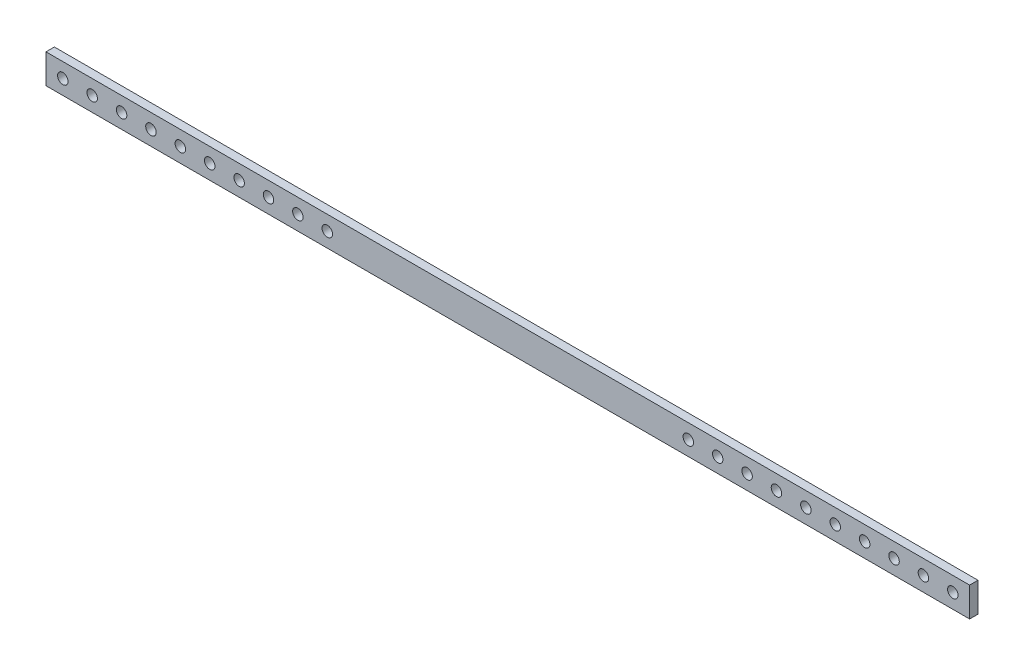
ISO-10303-21;
HEADER;
FILE_DESCRIPTION(('STEP AP214'),'2;1');
FILE_NAME('part.step','',(''),(''),'','','');
FILE_SCHEMA(('AUTOMOTIVE_DESIGN { 1 0 10303 214 1 1 1 1 }'));
ENDSEC;
DATA;
#1=APPLICATION_CONTEXT('core data for automotive mechanical design processes');
#2=APPLICATION_PROTOCOL_DEFINITION('international standard','automotive_design',2000,#1);
#3=PRODUCT_CONTEXT('',#1,'mechanical');
#4=PRODUCT('Part','Part','',(#3));
#5=PRODUCT_RELATED_PRODUCT_CATEGORY('part','',(#4));
#6=PRODUCT_DEFINITION_FORMATION('','',#4);
#7=PRODUCT_DEFINITION_CONTEXT('part definition',#1,'design');
#8=PRODUCT_DEFINITION('design','',#6,#7);
#9=PRODUCT_DEFINITION_SHAPE('','',#8);
#10=(LENGTH_UNIT() NAMED_UNIT(*) SI_UNIT(.MILLI.,.METRE.));
#11=(NAMED_UNIT(*) PLANE_ANGLE_UNIT() SI_UNIT($,.RADIAN.));
#12=(NAMED_UNIT(*) SI_UNIT($,.STERADIAN.) SOLID_ANGLE_UNIT());
#13=UNCERTAINTY_MEASURE_WITH_UNIT(LENGTH_MEASURE(1.E-05),#10,'distance_accuracy_value','');
#14=(GEOMETRIC_REPRESENTATION_CONTEXT(3) GLOBAL_UNCERTAINTY_ASSIGNED_CONTEXT((#13)) GLOBAL_UNIT_ASSIGNED_CONTEXT((#10,
#11,#12)) REPRESENTATION_CONTEXT('',''));
#15=CARTESIAN_POINT('',(0.,0.,0.));
#16=DIRECTION('',(0.,0.,1.));
#17=DIRECTION('',(1.,0.,0.));
#18=AXIS2_PLACEMENT_3D('',#15,#16,#17);
#19=CARTESIAN_POINT('',(0.,0.,2.));
#20=DIRECTION('',(0.,0.,-1.));
#21=DIRECTION('',(-1.,0.,0.));
#22=AXIS2_PLACEMENT_3D('',#19,#20,#21);
#23=PLANE('',#22);
#24=CARTESIAN_POINT('',(57.,0.,2.));
#25=DIRECTION('',(0.,0.,1.));
#26=DIRECTION('',(1.,0.,0.));
#27=AXIS2_PLACEMENT_3D('',#24,#25,#26);
#28=CIRCLE('',#27,1.24999999999999);
#29=CARTESIAN_POINT('',(58.25,0.,2.));
#30=VERTEX_POINT('',#29);
#31=EDGE_CURVE('E285',#30,#30,#28,.T.);
#32=ORIENTED_EDGE('',*,*,#31,.F.);
#33=EDGE_LOOP('',(#32));
#34=FACE_BOUND('',#33,.T.);
#35=CARTESIAN_POINT('',(106.,0.,2.));
#36=DIRECTION('',(0.,0.,1.));
#37=DIRECTION('',(1.,0.,0.));
#38=AXIS2_PLACEMENT_3D('',#35,#36,#37);
#39=CIRCLE('',#38,1.24999999999999);
#40=CARTESIAN_POINT('',(107.25,0.,2.));
#41=VERTEX_POINT('',#40);
#42=EDGE_CURVE('E168',#41,#41,#39,.T.);
#43=ORIENTED_EDGE('',*,*,#42,.F.);
#44=EDGE_LOOP('',(#43));
#45=FACE_BOUND('',#44,.T.);
#46=CARTESIAN_POINT('',(-99.,0.,2.));
#47=DIRECTION('',(0.,0.,1.));
#48=DIRECTION('',(1.,0.,0.));
#49=AXIS2_PLACEMENT_3D('',#46,#47,#48);
#50=CIRCLE('',#49,1.24999999999999);
#51=CARTESIAN_POINT('',(-97.75,0.,2.));
#52=VERTEX_POINT('',#51);
#53=EDGE_CURVE('E211',#52,#52,#50,.T.);
#54=ORIENTED_EDGE('',*,*,#53,.F.);
#55=EDGE_LOOP('',(#54));
#56=FACE_BOUND('',#55,.T.);
#57=CARTESIAN_POINT('',(-106.,0.,2.));
#58=DIRECTION('',(0.,0.,1.));
#59=DIRECTION('',(1.,0.,0.));
#60=AXIS2_PLACEMENT_3D('',#57,#58,#59);
#61=CIRCLE('',#60,1.24999999999999);
#62=CARTESIAN_POINT('',(-104.75,0.,2.));
#63=VERTEX_POINT('',#62);
#64=EDGE_CURVE('E214',#63,#63,#61,.T.);
#65=ORIENTED_EDGE('',*,*,#64,.F.);
#66=EDGE_LOOP('',(#65));
#67=FACE_BOUND('',#66,.T.);
#68=DIRECTION('',(0.,1.,0.));
#69=VECTOR('',#68,1.);
#70=CARTESIAN_POINT('',(110.,-3.5,2.));
#71=LINE('',#70,#69);
#72=CARTESIAN_POINT('',(110.,-3.5,2.));
#73=VERTEX_POINT('',#72);
#74=CARTESIAN_POINT('',(110.,3.5,2.));
#75=VERTEX_POINT('',#74);
#76=EDGE_CURVE('E96',#73,#75,#71,.T.);
#77=ORIENTED_EDGE('',*,*,#76,.T.);
#78=DIRECTION('',(-1.,0.,0.));
#79=VECTOR('',#78,1.);
#80=CARTESIAN_POINT('',(-110.,3.5,2.));
#81=LINE('',#80,#79);
#82=CARTESIAN_POINT('',(-110.,3.5,2.));
#83=VERTEX_POINT('',#82);
#84=EDGE_CURVE('E91',#75,#83,#81,.T.);
#85=ORIENTED_EDGE('',*,*,#84,.T.);
#86=DIRECTION('',(0.,-1.,0.));
#87=VECTOR('',#86,1.);
#88=CARTESIAN_POINT('',(-110.,-3.5,2.));
#89=LINE('',#88,#87);
#90=CARTESIAN_POINT('',(-110.,-3.5,2.));
#91=VERTEX_POINT('',#90);
#92=EDGE_CURVE('E94',#83,#91,#89,.T.);
#93=ORIENTED_EDGE('',*,*,#92,.T.);
#94=DIRECTION('',(1.,0.,0.));
#95=VECTOR('',#94,1.);
#96=CARTESIAN_POINT('',(-110.,-3.5,2.));
#97=LINE('',#96,#95);
#98=EDGE_CURVE('E60',#91,#73,#97,.T.);
#99=ORIENTED_EDGE('',*,*,#98,.T.);
#100=EDGE_LOOP('',(#77,#85,#93,#99));
#101=FACE_BOUND('',#100,.T.);
#102=CARTESIAN_POINT('',(-92.,0.,2.));
#103=DIRECTION('',(0.,0.,1.));
#104=DIRECTION('',(1.,0.,0.));
#105=AXIS2_PLACEMENT_3D('',#102,#103,#104);
#106=CIRCLE('',#105,1.24999999999999);
#107=CARTESIAN_POINT('',(-90.75,0.,2.));
#108=VERTEX_POINT('',#107);
#109=EDGE_CURVE('E124',#108,#108,#106,.T.);
#110=ORIENTED_EDGE('',*,*,#109,.F.);
#111=EDGE_LOOP('',(#110));
#112=FACE_BOUND('',#111,.T.);
#113=CARTESIAN_POINT('',(-85.,0.,2.));
#114=DIRECTION('',(0.,0.,1.));
#115=DIRECTION('',(1.,0.,0.));
#116=AXIS2_PLACEMENT_3D('',#113,#114,#115);
#117=CIRCLE('',#116,1.24999999999999);
#118=CARTESIAN_POINT('',(-83.75,0.,2.));
#119=VERTEX_POINT('',#118);
#120=EDGE_CURVE('E130',#119,#119,#117,.T.);
#121=ORIENTED_EDGE('',*,*,#120,.F.);
#122=EDGE_LOOP('',(#121));
#123=FACE_BOUND('',#122,.T.);
#124=CARTESIAN_POINT('',(-78.,0.,2.));
#125=DIRECTION('',(0.,0.,1.));
#126=DIRECTION('',(1.,0.,0.));
#127=AXIS2_PLACEMENT_3D('',#124,#125,#126);
#128=CIRCLE('',#127,1.24999999999999);
#129=CARTESIAN_POINT('',(-76.75,0.,2.));
#130=VERTEX_POINT('',#129);
#131=EDGE_CURVE('E136',#130,#130,#128,.T.);
#132=ORIENTED_EDGE('',*,*,#131,.F.);
#133=EDGE_LOOP('',(#132));
#134=FACE_BOUND('',#133,.T.);
#135=CARTESIAN_POINT('',(-71.,0.,2.));
#136=DIRECTION('',(0.,0.,1.));
#137=DIRECTION('',(1.,0.,0.));
#138=AXIS2_PLACEMENT_3D('',#135,#136,#137);
#139=CIRCLE('',#138,1.24999999999999);
#140=CARTESIAN_POINT('',(-69.75,0.,2.));
#141=VERTEX_POINT('',#140);
#142=EDGE_CURVE('E142',#141,#141,#139,.T.);
#143=ORIENTED_EDGE('',*,*,#142,.F.);
#144=EDGE_LOOP('',(#143));
#145=FACE_BOUND('',#144,.T.);
#146=CARTESIAN_POINT('',(-64.,0.,2.));
#147=DIRECTION('',(0.,0.,1.));
#148=DIRECTION('',(1.,0.,0.));
#149=AXIS2_PLACEMENT_3D('',#146,#147,#148);
#150=CIRCLE('',#149,1.24999999999999);
#151=CARTESIAN_POINT('',(-62.75,0.,2.));
#152=VERTEX_POINT('',#151);
#153=EDGE_CURVE('E148',#152,#152,#150,.T.);
#154=ORIENTED_EDGE('',*,*,#153,.F.);
#155=EDGE_LOOP('',(#154));
#156=FACE_BOUND('',#155,.T.);
#157=CARTESIAN_POINT('',(-57.,0.,2.));
#158=DIRECTION('',(0.,0.,1.));
#159=DIRECTION('',(1.,0.,0.));
#160=AXIS2_PLACEMENT_3D('',#157,#158,#159);
#161=CIRCLE('',#160,1.24999999999999);
#162=CARTESIAN_POINT('',(-55.75,0.,2.));
#163=VERTEX_POINT('',#162);
#164=EDGE_CURVE('E154',#163,#163,#161,.T.);
#165=ORIENTED_EDGE('',*,*,#164,.F.);
#166=EDGE_LOOP('',(#165));
#167=FACE_BOUND('',#166,.T.);
#168=CARTESIAN_POINT('',(-50.,0.,2.));
#169=DIRECTION('',(0.,0.,1.));
#170=DIRECTION('',(1.,0.,0.));
#171=AXIS2_PLACEMENT_3D('',#168,#169,#170);
#172=CIRCLE('',#171,1.24999999999999);
#173=CARTESIAN_POINT('',(-48.75,0.,2.));
#174=VERTEX_POINT('',#173);
#175=EDGE_CURVE('E160',#174,#174,#172,.T.);
#176=ORIENTED_EDGE('',*,*,#175,.F.);
#177=EDGE_LOOP('',(#176));
#178=FACE_BOUND('',#177,.T.);
#179=CARTESIAN_POINT('',(-43.,0.,2.));
#180=DIRECTION('',(0.,0.,1.));
#181=DIRECTION('',(1.,0.,0.));
#182=AXIS2_PLACEMENT_3D('',#179,#180,#181);
#183=CIRCLE('',#182,1.24999999999999);
#184=CARTESIAN_POINT('',(-41.75,0.,2.));
#185=VERTEX_POINT('',#184);
#186=EDGE_CURVE('E11',#185,#185,#183,.T.);
#187=ORIENTED_EDGE('',*,*,#186,.F.);
#188=EDGE_LOOP('',(#187));
#189=FACE_BOUND('',#188,.T.);
#190=CARTESIAN_POINT('',(99.,0.,2.));
#191=DIRECTION('',(0.,0.,1.));
#192=DIRECTION('',(1.,0.,0.));
#193=AXIS2_PLACEMENT_3D('',#190,#191,#192);
#194=CIRCLE('',#193,1.24999999999999);
#195=CARTESIAN_POINT('',(100.25,0.,2.));
#196=VERTEX_POINT('',#195);
#197=EDGE_CURVE('E169',#196,#196,#194,.T.);
#198=ORIENTED_EDGE('',*,*,#197,.F.);
#199=EDGE_LOOP('',(#198));
#200=FACE_BOUND('',#199,.T.);
#201=CARTESIAN_POINT('',(92.,0.,2.));
#202=DIRECTION('',(0.,0.,1.));
#203=DIRECTION('',(1.,0.,0.));
#204=AXIS2_PLACEMENT_3D('',#201,#202,#203);
#205=CIRCLE('',#204,1.24999999999999);
#206=CARTESIAN_POINT('',(93.25,0.,2.));
#207=VERTEX_POINT('',#206);
#208=EDGE_CURVE('E173',#207,#207,#205,.T.);
#209=ORIENTED_EDGE('',*,*,#208,.F.);
#210=EDGE_LOOP('',(#209));
#211=FACE_BOUND('',#210,.T.);
#212=CARTESIAN_POINT('',(85.,0.,2.));
#213=DIRECTION('',(0.,0.,1.));
#214=DIRECTION('',(1.,0.,0.));
#215=AXIS2_PLACEMENT_3D('',#212,#213,#214);
#216=CIRCLE('',#215,1.24999999999999);
#217=CARTESIAN_POINT('',(86.25,0.,2.));
#218=VERTEX_POINT('',#217);
#219=EDGE_CURVE('E174',#218,#218,#216,.T.);
#220=ORIENTED_EDGE('',*,*,#219,.F.);
#221=EDGE_LOOP('',(#220));
#222=FACE_BOUND('',#221,.T.);
#223=CARTESIAN_POINT('',(78.,0.,2.));
#224=DIRECTION('',(0.,0.,1.));
#225=DIRECTION('',(1.,0.,0.));
#226=AXIS2_PLACEMENT_3D('',#223,#224,#225);
#227=CIRCLE('',#226,1.24999999999999);
#228=CARTESIAN_POINT('',(79.25,0.,2.));
#229=VERTEX_POINT('',#228);
#230=EDGE_CURVE('E177',#229,#229,#227,.T.);
#231=ORIENTED_EDGE('',*,*,#230,.F.);
#232=EDGE_LOOP('',(#231));
#233=FACE_BOUND('',#232,.T.);
#234=CARTESIAN_POINT('',(71.,0.,2.));
#235=DIRECTION('',(0.,0.,1.));
#236=DIRECTION('',(1.,0.,0.));
#237=AXIS2_PLACEMENT_3D('',#234,#235,#236);
#238=CIRCLE('',#237,1.24999999999999);
#239=CARTESIAN_POINT('',(72.25,0.,2.));
#240=VERTEX_POINT('',#239);
#241=EDGE_CURVE('E180',#240,#240,#238,.T.);
#242=ORIENTED_EDGE('',*,*,#241,.F.);
#243=EDGE_LOOP('',(#242));
#244=FACE_BOUND('',#243,.T.);
#245=CARTESIAN_POINT('',(64.,0.,2.));
#246=DIRECTION('',(0.,0.,1.));
#247=DIRECTION('',(1.,0.,0.));
#248=AXIS2_PLACEMENT_3D('',#245,#246,#247);
#249=CIRCLE('',#248,1.24999999999999);
#250=CARTESIAN_POINT('',(65.25,0.,2.));
#251=VERTEX_POINT('',#250);
#252=EDGE_CURVE('E190',#251,#251,#249,.T.);
#253=ORIENTED_EDGE('',*,*,#252,.F.);
#254=EDGE_LOOP('',(#253));
#255=FACE_BOUND('',#254,.T.);
#256=CARTESIAN_POINT('',(50.,0.,2.));
#257=DIRECTION('',(0.,0.,1.));
#258=DIRECTION('',(1.,0.,0.));
#259=AXIS2_PLACEMENT_3D('',#256,#257,#258);
#260=CIRCLE('',#259,1.24999999999999);
#261=CARTESIAN_POINT('',(51.25,0.,2.));
#262=VERTEX_POINT('',#261);
#263=EDGE_CURVE('E271',#262,#262,#260,.T.);
#264=ORIENTED_EDGE('',*,*,#263,.F.);
#265=EDGE_LOOP('',(#264));
#266=FACE_BOUND('',#265,.T.);
#267=CARTESIAN_POINT('',(43.,0.,2.));
#268=DIRECTION('',(0.,0.,1.));
#269=DIRECTION('',(1.,0.,0.));
#270=AXIS2_PLACEMENT_3D('',#267,#268,#269);
#271=CIRCLE('',#270,1.24999999999999);
#272=CARTESIAN_POINT('',(44.25,0.,2.));
#273=VERTEX_POINT('',#272);
#274=EDGE_CURVE('E274',#273,#273,#271,.T.);
#275=ORIENTED_EDGE('',*,*,#274,.F.);
#276=EDGE_LOOP('',(#275));
#277=FACE_BOUND('',#276,.T.);
#278=ADVANCED_FACE('F41',(#34,#45,#56,#67,#101,#112,#123,#134,#145,#156,#167,#178,#189,#200,
#211,#222,#233,#244,#255,#266,#277),#23,.F.);
#279=CARTESIAN_POINT('',(-43.,0.,2.));
#280=DIRECTION('',(0.,0.,1.));
#281=DIRECTION('',(1.,0.,0.));
#282=AXIS2_PLACEMENT_3D('',#279,#280,#281);
#283=CYLINDRICAL_SURFACE('',#282,1.24999999999999);
#284=CARTESIAN_POINT('',(-43.,0.,0.));
#285=DIRECTION('',(0.,0.,-1.));
#286=DIRECTION('',(-1.,0.,0.));
#287=AXIS2_PLACEMENT_3D('',#284,#285,#286);
#288=CIRCLE('',#287,1.24999999999999);
#289=CARTESIAN_POINT('',(-44.25,0.,0.));
#290=VERTEX_POINT('',#289);
#291=EDGE_CURVE('E51',#290,#290,#288,.T.);
#292=ORIENTED_EDGE('',*,*,#291,.T.);
#293=EDGE_LOOP('',(#292));
#294=FACE_BOUND('',#293,.T.);
#295=ORIENTED_EDGE('',*,*,#186,.T.);
#296=EDGE_LOOP('',(#295));
#297=FACE_BOUND('',#296,.T.);
#298=ADVANCED_FACE('F43',(#294,#297),#283,.F.);
#299=CARTESIAN_POINT('',(-50.,0.,2.));
#300=DIRECTION('',(0.,0.,1.));
#301=DIRECTION('',(1.,0.,0.));
#302=AXIS2_PLACEMENT_3D('',#299,#300,#301);
#303=CYLINDRICAL_SURFACE('',#302,1.24999999999999);
#304=CARTESIAN_POINT('',(-50.,0.,0.));
#305=DIRECTION('',(0.,0.,-1.));
#306=DIRECTION('',(-1.,0.,0.));
#307=AXIS2_PLACEMENT_3D('',#304,#305,#306);
#308=CIRCLE('',#307,1.24999999999999);
#309=CARTESIAN_POINT('',(-51.25,0.,0.));
#310=VERTEX_POINT('',#309);
#311=EDGE_CURVE('E157',#310,#310,#308,.T.);
#312=ORIENTED_EDGE('',*,*,#311,.T.);
#313=EDGE_LOOP('',(#312));
#314=FACE_BOUND('',#313,.T.);
#315=ORIENTED_EDGE('',*,*,#175,.T.);
#316=EDGE_LOOP('',(#315));
#317=FACE_BOUND('',#316,.T.);
#318=ADVANCED_FACE('F249',(#314,#317),#303,.F.);
#319=CARTESIAN_POINT('',(-57.,0.,2.));
#320=DIRECTION('',(0.,0.,1.));
#321=DIRECTION('',(1.,0.,0.));
#322=AXIS2_PLACEMENT_3D('',#319,#320,#321);
#323=CYLINDRICAL_SURFACE('',#322,1.24999999999999);
#324=CARTESIAN_POINT('',(-57.,0.,0.));
#325=DIRECTION('',(0.,0.,-1.));
#326=DIRECTION('',(-1.,0.,0.));
#327=AXIS2_PLACEMENT_3D('',#324,#325,#326);
#328=CIRCLE('',#327,1.24999999999999);
#329=CARTESIAN_POINT('',(-58.25,0.,0.));
#330=VERTEX_POINT('',#329);
#331=EDGE_CURVE('E151',#330,#330,#328,.T.);
#332=ORIENTED_EDGE('',*,*,#331,.T.);
#333=EDGE_LOOP('',(#332));
#334=FACE_BOUND('',#333,.T.);
#335=ORIENTED_EDGE('',*,*,#164,.T.);
#336=EDGE_LOOP('',(#335));
#337=FACE_BOUND('',#336,.T.);
#338=ADVANCED_FACE('F362',(#334,#337),#323,.F.);
#339=CARTESIAN_POINT('',(-64.,0.,2.));
#340=DIRECTION('',(0.,0.,1.));
#341=DIRECTION('',(1.,0.,0.));
#342=AXIS2_PLACEMENT_3D('',#339,#340,#341);
#343=CYLINDRICAL_SURFACE('',#342,1.24999999999999);
#344=CARTESIAN_POINT('',(-64.,0.,0.));
#345=DIRECTION('',(0.,0.,-1.));
#346=DIRECTION('',(-1.,0.,0.));
#347=AXIS2_PLACEMENT_3D('',#344,#345,#346);
#348=CIRCLE('',#347,1.24999999999999);
#349=CARTESIAN_POINT('',(-65.25,0.,0.));
#350=VERTEX_POINT('',#349);
#351=EDGE_CURVE('E145',#350,#350,#348,.T.);
#352=ORIENTED_EDGE('',*,*,#351,.T.);
#353=EDGE_LOOP('',(#352));
#354=FACE_BOUND('',#353,.T.);
#355=ORIENTED_EDGE('',*,*,#153,.T.);
#356=EDGE_LOOP('',(#355));
#357=FACE_BOUND('',#356,.T.);
#358=ADVANCED_FACE('F358',(#354,#357),#343,.F.);
#359=CARTESIAN_POINT('',(-71.,0.,2.));
#360=DIRECTION('',(0.,0.,1.));
#361=DIRECTION('',(1.,0.,0.));
#362=AXIS2_PLACEMENT_3D('',#359,#360,#361);
#363=CYLINDRICAL_SURFACE('',#362,1.24999999999999);
#364=CARTESIAN_POINT('',(-71.,0.,0.));
#365=DIRECTION('',(0.,0.,-1.));
#366=DIRECTION('',(-1.,0.,0.));
#367=AXIS2_PLACEMENT_3D('',#364,#365,#366);
#368=CIRCLE('',#367,1.24999999999999);
#369=CARTESIAN_POINT('',(-72.25,0.,0.));
#370=VERTEX_POINT('',#369);
#371=EDGE_CURVE('E139',#370,#370,#368,.T.);
#372=ORIENTED_EDGE('',*,*,#371,.T.);
#373=EDGE_LOOP('',(#372));
#374=FACE_BOUND('',#373,.T.);
#375=ORIENTED_EDGE('',*,*,#142,.T.);
#376=EDGE_LOOP('',(#375));
#377=FACE_BOUND('',#376,.T.);
#378=ADVANCED_FACE('F354',(#374,#377),#363,.F.);
#379=CARTESIAN_POINT('',(-78.,0.,2.));
#380=DIRECTION('',(0.,0.,1.));
#381=DIRECTION('',(1.,0.,0.));
#382=AXIS2_PLACEMENT_3D('',#379,#380,#381);
#383=CYLINDRICAL_SURFACE('',#382,1.24999999999999);
#384=CARTESIAN_POINT('',(-78.,0.,0.));
#385=DIRECTION('',(0.,0.,-1.));
#386=DIRECTION('',(-1.,0.,0.));
#387=AXIS2_PLACEMENT_3D('',#384,#385,#386);
#388=CIRCLE('',#387,1.24999999999999);
#389=CARTESIAN_POINT('',(-79.25,0.,0.));
#390=VERTEX_POINT('',#389);
#391=EDGE_CURVE('E133',#390,#390,#388,.T.);
#392=ORIENTED_EDGE('',*,*,#391,.T.);
#393=EDGE_LOOP('',(#392));
#394=FACE_BOUND('',#393,.T.);
#395=ORIENTED_EDGE('',*,*,#131,.T.);
#396=EDGE_LOOP('',(#395));
#397=FACE_BOUND('',#396,.T.);
#398=ADVANCED_FACE('F350',(#394,#397),#383,.F.);
#399=CARTESIAN_POINT('',(-85.,0.,2.));
#400=DIRECTION('',(0.,0.,1.));
#401=DIRECTION('',(1.,0.,0.));
#402=AXIS2_PLACEMENT_3D('',#399,#400,#401);
#403=CYLINDRICAL_SURFACE('',#402,1.24999999999999);
#404=CARTESIAN_POINT('',(-85.,0.,0.));
#405=DIRECTION('',(0.,0.,-1.));
#406=DIRECTION('',(-1.,0.,0.));
#407=AXIS2_PLACEMENT_3D('',#404,#405,#406);
#408=CIRCLE('',#407,1.24999999999999);
#409=CARTESIAN_POINT('',(-86.25,0.,0.));
#410=VERTEX_POINT('',#409);
#411=EDGE_CURVE('E127',#410,#410,#408,.T.);
#412=ORIENTED_EDGE('',*,*,#411,.T.);
#413=EDGE_LOOP('',(#412));
#414=FACE_BOUND('',#413,.T.);
#415=ORIENTED_EDGE('',*,*,#120,.T.);
#416=EDGE_LOOP('',(#415));
#417=FACE_BOUND('',#416,.T.);
#418=ADVANCED_FACE('F346',(#414,#417),#403,.F.);
#419=CARTESIAN_POINT('',(-92.,0.,2.));
#420=DIRECTION('',(0.,0.,1.));
#421=DIRECTION('',(1.,0.,0.));
#422=AXIS2_PLACEMENT_3D('',#419,#420,#421);
#423=CYLINDRICAL_SURFACE('',#422,1.24999999999999);
#424=CARTESIAN_POINT('',(-92.,0.,0.));
#425=DIRECTION('',(0.,0.,-1.));
#426=DIRECTION('',(-1.,0.,0.));
#427=AXIS2_PLACEMENT_3D('',#424,#425,#426);
#428=CIRCLE('',#427,1.24999999999999);
#429=CARTESIAN_POINT('',(-93.25,0.,0.));
#430=VERTEX_POINT('',#429);
#431=EDGE_CURVE('E121',#430,#430,#428,.T.);
#432=ORIENTED_EDGE('',*,*,#431,.T.);
#433=EDGE_LOOP('',(#432));
#434=FACE_BOUND('',#433,.T.);
#435=ORIENTED_EDGE('',*,*,#109,.T.);
#436=EDGE_LOOP('',(#435));
#437=FACE_BOUND('',#436,.T.);
#438=ADVANCED_FACE('F342',(#434,#437),#423,.F.);
#439=CARTESIAN_POINT('',(110.,-3.5,2.));
#440=DIRECTION('',(-1.,0.,0.));
#441=DIRECTION('',(0.,0.,1.));
#442=AXIS2_PLACEMENT_3D('',#439,#440,#441);
#443=PLANE('',#442);
#444=DIRECTION('',(0.,1.,0.));
#445=VECTOR('',#444,1.);
#446=CARTESIAN_POINT('',(110.,-3.5,0.));
#447=LINE('',#446,#445);
#448=CARTESIAN_POINT('',(110.,-3.5,0.));
#449=VERTEX_POINT('',#448);
#450=CARTESIAN_POINT('',(110.,3.5,0.));
#451=VERTEX_POINT('',#450);
#452=EDGE_CURVE('E111',#449,#451,#447,.T.);
#453=ORIENTED_EDGE('',*,*,#452,.T.);
#454=DIRECTION('',(0.,0.,-1.));
#455=VECTOR('',#454,1.);
#456=CARTESIAN_POINT('',(110.,3.5,2.));
#457=LINE('',#456,#455);
#458=EDGE_CURVE('E102',#75,#451,#457,.T.);
#459=ORIENTED_EDGE('',*,*,#458,.F.);
#460=ORIENTED_EDGE('',*,*,#76,.F.);
#461=DIRECTION('',(0.,0.,-1.));
#462=VECTOR('',#461,1.);
#463=CARTESIAN_POINT('',(110.,-3.5,2.));
#464=LINE('',#463,#462);
#465=EDGE_CURVE('E107',#73,#449,#464,.T.);
#466=ORIENTED_EDGE('',*,*,#465,.T.);
#467=EDGE_LOOP('',(#453,#459,#460,#466));
#468=FACE_BOUND('',#467,.T.);
#469=ADVANCED_FACE('F339',(#468),#443,.F.);
#470=CARTESIAN_POINT('',(-110.,3.5,2.));
#471=DIRECTION('',(0.,-1.,0.));
#472=DIRECTION('',(0.,0.,-1.));
#473=AXIS2_PLACEMENT_3D('',#470,#471,#472);
#474=PLANE('',#473);
#475=DIRECTION('',(-1.,0.,0.));
#476=VECTOR('',#475,1.);
#477=CARTESIAN_POINT('',(-110.,3.5,0.));
#478=LINE('',#477,#476);
#479=CARTESIAN_POINT('',(-110.,3.5,0.));
#480=VERTEX_POINT('',#479);
#481=EDGE_CURVE('E101',#451,#480,#478,.T.);
#482=ORIENTED_EDGE('',*,*,#481,.T.);
#483=DIRECTION('',(0.,0.,-1.));
#484=VECTOR('',#483,1.);
#485=CARTESIAN_POINT('',(-110.,3.5,2.));
#486=LINE('',#485,#484);
#487=EDGE_CURVE('E99',#83,#480,#486,.T.);
#488=ORIENTED_EDGE('',*,*,#487,.F.);
#489=ORIENTED_EDGE('',*,*,#84,.F.);
#490=ORIENTED_EDGE('',*,*,#458,.T.);
#491=EDGE_LOOP('',(#482,#488,#489,#490));
#492=FACE_BOUND('',#491,.T.);
#493=ADVANCED_FACE('F100',(#492),#474,.F.);
#494=CARTESIAN_POINT('',(-110.,-3.5,2.));
#495=DIRECTION('',(1.,0.,0.));
#496=DIRECTION('',(0.,0.,-1.));
#497=AXIS2_PLACEMENT_3D('',#494,#495,#496);
#498=PLANE('',#497);
#499=DIRECTION('',(0.,-1.,0.));
#500=VECTOR('',#499,1.);
#501=CARTESIAN_POINT('',(-110.,-3.5,0.));
#502=LINE('',#501,#500);
#503=CARTESIAN_POINT('',(-110.,-3.5,0.));
#504=VERTEX_POINT('',#503);
#505=EDGE_CURVE('E77',#480,#504,#502,.T.);
#506=ORIENTED_EDGE('',*,*,#505,.T.);
#507=DIRECTION('',(0.,0.,-1.));
#508=VECTOR('',#507,1.);
#509=CARTESIAN_POINT('',(-110.,-3.5,2.));
#510=LINE('',#509,#508);
#511=EDGE_CURVE('E103',#91,#504,#510,.T.);
#512=ORIENTED_EDGE('',*,*,#511,.F.);
#513=ORIENTED_EDGE('',*,*,#92,.F.);
#514=ORIENTED_EDGE('',*,*,#487,.T.);
#515=EDGE_LOOP('',(#506,#512,#513,#514));
#516=FACE_BOUND('',#515,.T.);
#517=ADVANCED_FACE('F105',(#516),#498,.F.);
#518=CARTESIAN_POINT('',(-110.,-3.5,2.));
#519=DIRECTION('',(0.,1.,0.));
#520=DIRECTION('',(0.,0.,1.));
#521=AXIS2_PLACEMENT_3D('',#518,#519,#520);
#522=PLANE('',#521);
#523=DIRECTION('',(1.,0.,0.));
#524=VECTOR('',#523,1.);
#525=CARTESIAN_POINT('',(-110.,-3.5,0.));
#526=LINE('',#525,#524);
#527=EDGE_CURVE('E83',#504,#449,#526,.T.);
#528=ORIENTED_EDGE('',*,*,#527,.T.);
#529=ORIENTED_EDGE('',*,*,#465,.F.);
#530=ORIENTED_EDGE('',*,*,#98,.F.);
#531=ORIENTED_EDGE('',*,*,#511,.T.);
#532=EDGE_LOOP('',(#528,#529,#530,#531));
#533=FACE_BOUND('',#532,.T.);
#534=ADVANCED_FACE('F226',(#533),#522,.F.);
#535=CARTESIAN_POINT('',(0.,0.,0.));
#536=DIRECTION('',(0.,0.,-1.));
#537=DIRECTION('',(-1.,0.,0.));
#538=AXIS2_PLACEMENT_3D('',#535,#536,#537);
#539=PLANE('',#538);
#540=CARTESIAN_POINT('',(43.,0.,0.));
#541=DIRECTION('',(0.,0.,-1.));
#542=DIRECTION('',(-1.,0.,0.));
#543=AXIS2_PLACEMENT_3D('',#540,#541,#542);
#544=CIRCLE('',#543,1.24999999999999);
#545=CARTESIAN_POINT('',(41.75,0.,0.));
#546=VERTEX_POINT('',#545);
#547=EDGE_CURVE('E276',#546,#546,#544,.T.);
#548=ORIENTED_EDGE('',*,*,#547,.F.);
#549=EDGE_LOOP('',(#548));
#550=FACE_BOUND('',#549,.T.);
#551=CARTESIAN_POINT('',(50.,0.,0.));
#552=DIRECTION('',(0.,0.,-1.));
#553=DIRECTION('',(-1.,0.,0.));
#554=AXIS2_PLACEMENT_3D('',#551,#552,#553);
#555=CIRCLE('',#554,1.24999999999999);
#556=CARTESIAN_POINT('',(48.75,0.,0.));
#557=VERTEX_POINT('',#556);
#558=EDGE_CURVE('E282',#557,#557,#555,.T.);
#559=ORIENTED_EDGE('',*,*,#558,.F.);
#560=EDGE_LOOP('',(#559));
#561=FACE_BOUND('',#560,.T.);
#562=CARTESIAN_POINT('',(57.,0.,0.));
#563=DIRECTION('',(0.,0.,-1.));
#564=DIRECTION('',(-1.,0.,0.));
#565=AXIS2_PLACEMENT_3D('',#562,#563,#564);
#566=CIRCLE('',#565,1.24999999999999);
#567=CARTESIAN_POINT('',(55.75,0.,0.));
#568=VERTEX_POINT('',#567);
#569=EDGE_CURVE('E287',#568,#568,#566,.T.);
#570=ORIENTED_EDGE('',*,*,#569,.F.);
#571=EDGE_LOOP('',(#570));
#572=FACE_BOUND('',#571,.T.);
#573=CARTESIAN_POINT('',(64.,0.,0.));
#574=DIRECTION('',(0.,0.,-1.));
#575=DIRECTION('',(-1.,0.,0.));
#576=AXIS2_PLACEMENT_3D('',#573,#574,#575);
#577=CIRCLE('',#576,1.24999999999999);
#578=CARTESIAN_POINT('',(62.75,0.,0.));
#579=VERTEX_POINT('',#578);
#580=EDGE_CURVE('E45',#579,#579,#577,.T.);
#581=ORIENTED_EDGE('',*,*,#580,.F.);
#582=EDGE_LOOP('',(#581));
#583=FACE_BOUND('',#582,.T.);
#584=CARTESIAN_POINT('',(71.,0.,0.));
#585=DIRECTION('',(0.,0.,-1.));
#586=DIRECTION('',(-1.,0.,0.));
#587=AXIS2_PLACEMENT_3D('',#584,#585,#586);
#588=CIRCLE('',#587,1.24999999999999);
#589=CARTESIAN_POINT('',(69.75,0.,0.));
#590=VERTEX_POINT('',#589);
#591=EDGE_CURVE('E178',#590,#590,#588,.T.);
#592=ORIENTED_EDGE('',*,*,#591,.F.);
#593=EDGE_LOOP('',(#592));
#594=FACE_BOUND('',#593,.T.);
#595=CARTESIAN_POINT('',(78.,0.,0.));
#596=DIRECTION('',(0.,0.,-1.));
#597=DIRECTION('',(-1.,0.,0.));
#598=AXIS2_PLACEMENT_3D('',#595,#596,#597);
#599=CIRCLE('',#598,1.24999999999999);
#600=CARTESIAN_POINT('',(76.7500000000001,0.,0.));
#601=VERTEX_POINT('',#600);
#602=EDGE_CURVE('E175',#601,#601,#599,.T.);
#603=ORIENTED_EDGE('',*,*,#602,.F.);
#604=EDGE_LOOP('',(#603));
#605=FACE_BOUND('',#604,.T.);
#606=CARTESIAN_POINT('',(85.,0.,0.));
#607=DIRECTION('',(0.,0.,-1.));
#608=DIRECTION('',(-1.,0.,0.));
#609=AXIS2_PLACEMENT_3D('',#606,#607,#608);
#610=CIRCLE('',#609,1.24999999999999);
#611=CARTESIAN_POINT('',(83.75,0.,0.));
#612=VERTEX_POINT('',#611);
#613=EDGE_CURVE('E170',#612,#612,#610,.T.);
#614=ORIENTED_EDGE('',*,*,#613,.F.);
#615=EDGE_LOOP('',(#614));
#616=FACE_BOUND('',#615,.T.);
#617=CARTESIAN_POINT('',(92.,0.,0.));
#618=DIRECTION('',(0.,0.,-1.));
#619=DIRECTION('',(-1.,0.,0.));
#620=AXIS2_PLACEMENT_3D('',#617,#618,#619);
#621=CIRCLE('',#620,1.24999999999999);
#622=CARTESIAN_POINT('',(90.7500000000001,0.,0.));
#623=VERTEX_POINT('',#622);
#624=EDGE_CURVE('E198',#623,#623,#621,.T.);
#625=ORIENTED_EDGE('',*,*,#624,.F.);
#626=EDGE_LOOP('',(#625));
#627=FACE_BOUND('',#626,.T.);
#628=CARTESIAN_POINT('',(99.,0.,0.));
#629=DIRECTION('',(0.,0.,-1.));
#630=DIRECTION('',(-1.,0.,0.));
#631=AXIS2_PLACEMENT_3D('',#628,#629,#630);
#632=CIRCLE('',#631,1.24999999999999);
#633=CARTESIAN_POINT('',(97.75,0.,0.));
#634=VERTEX_POINT('',#633);
#635=EDGE_CURVE('E165',#634,#634,#632,.T.);
#636=ORIENTED_EDGE('',*,*,#635,.F.);
#637=EDGE_LOOP('',(#636));
#638=FACE_BOUND('',#637,.T.);
#639=CARTESIAN_POINT('',(106.,0.,0.));
#640=DIRECTION('',(0.,0.,-1.));
#641=DIRECTION('',(-1.,0.,0.));
#642=AXIS2_PLACEMENT_3D('',#639,#640,#641);
#643=CIRCLE('',#642,1.24999999999999);
#644=CARTESIAN_POINT('',(104.75,0.,0.));
#645=VERTEX_POINT('',#644);
#646=EDGE_CURVE('E205',#645,#645,#643,.T.);
#647=ORIENTED_EDGE('',*,*,#646,.F.);
#648=EDGE_LOOP('',(#647));
#649=FACE_BOUND('',#648,.T.);
#650=CARTESIAN_POINT('',(-99.,0.,0.));
#651=DIRECTION('',(0.,0.,-1.));
#652=DIRECTION('',(-1.,0.,0.));
#653=AXIS2_PLACEMENT_3D('',#650,#651,#652);
#654=CIRCLE('',#653,1.24999999999999);
#655=CARTESIAN_POINT('',(-100.25,0.,0.));
#656=VERTEX_POINT('',#655);
#657=EDGE_CURVE('E208',#656,#656,#654,.T.);
#658=ORIENTED_EDGE('',*,*,#657,.F.);
#659=EDGE_LOOP('',(#658));
#660=FACE_BOUND('',#659,.T.);
#661=CARTESIAN_POINT('',(-106.,0.,0.));
#662=DIRECTION('',(0.,0.,-1.));
#663=DIRECTION('',(-1.,0.,0.));
#664=AXIS2_PLACEMENT_3D('',#661,#662,#663);
#665=CIRCLE('',#664,1.24999999999999);
#666=CARTESIAN_POINT('',(-107.25,0.,0.));
#667=VERTEX_POINT('',#666);
#668=EDGE_CURVE('E114',#667,#667,#665,.T.);
#669=ORIENTED_EDGE('',*,*,#668,.F.);
#670=EDGE_LOOP('',(#669));
#671=FACE_BOUND('',#670,.T.);
#672=ORIENTED_EDGE('',*,*,#452,.F.);
#673=ORIENTED_EDGE('',*,*,#527,.F.);
#674=ORIENTED_EDGE('',*,*,#505,.F.);
#675=ORIENTED_EDGE('',*,*,#481,.F.);
#676=EDGE_LOOP('',(#672,#673,#674,#675));
#677=FACE_BOUND('',#676,.T.);
#678=ORIENTED_EDGE('',*,*,#431,.F.);
#679=EDGE_LOOP('',(#678));
#680=FACE_BOUND('',#679,.T.);
#681=ORIENTED_EDGE('',*,*,#411,.F.);
#682=EDGE_LOOP('',(#681));
#683=FACE_BOUND('',#682,.T.);
#684=ORIENTED_EDGE('',*,*,#391,.F.);
#685=EDGE_LOOP('',(#684));
#686=FACE_BOUND('',#685,.T.);
#687=ORIENTED_EDGE('',*,*,#371,.F.);
#688=EDGE_LOOP('',(#687));
#689=FACE_BOUND('',#688,.T.);
#690=ORIENTED_EDGE('',*,*,#351,.F.);
#691=EDGE_LOOP('',(#690));
#692=FACE_BOUND('',#691,.T.);
#693=ORIENTED_EDGE('',*,*,#331,.F.);
#694=EDGE_LOOP('',(#693));
#695=FACE_BOUND('',#694,.T.);
#696=ORIENTED_EDGE('',*,*,#311,.F.);
#697=EDGE_LOOP('',(#696));
#698=FACE_BOUND('',#697,.T.);
#699=ORIENTED_EDGE('',*,*,#291,.F.);
#700=EDGE_LOOP('',(#699));
#701=FACE_BOUND('',#700,.T.);
#702=ADVANCED_FACE('F223',(#550,#561,#572,#583,#594,#605,#616,#627,#638,#649,#660,#671,#677,
#680,#683,#686,#689,#692,#695,#698,#701),#539,.T.);
#703=CARTESIAN_POINT('',(-106.,0.,2.));
#704=DIRECTION('',(0.,0.,1.));
#705=DIRECTION('',(1.,0.,0.));
#706=AXIS2_PLACEMENT_3D('',#703,#704,#705);
#707=CYLINDRICAL_SURFACE('',#706,1.24999999999999);
#708=ORIENTED_EDGE('',*,*,#668,.T.);
#709=EDGE_LOOP('',(#708));
#710=FACE_BOUND('',#709,.T.);
#711=ORIENTED_EDGE('',*,*,#64,.T.);
#712=EDGE_LOOP('',(#711));
#713=FACE_BOUND('',#712,.T.);
#714=ADVANCED_FACE('F220',(#710,#713),#707,.F.);
#715=CARTESIAN_POINT('',(-99.,0.,2.));
#716=DIRECTION('',(0.,0.,1.));
#717=DIRECTION('',(1.,0.,0.));
#718=AXIS2_PLACEMENT_3D('',#715,#716,#717);
#719=CYLINDRICAL_SURFACE('',#718,1.24999999999999);
#720=ORIENTED_EDGE('',*,*,#657,.T.);
#721=EDGE_LOOP('',(#720));
#722=FACE_BOUND('',#721,.T.);
#723=ORIENTED_EDGE('',*,*,#53,.T.);
#724=EDGE_LOOP('',(#723));
#725=FACE_BOUND('',#724,.T.);
#726=ADVANCED_FACE('F326',(#722,#725),#719,.F.);
#727=CARTESIAN_POINT('',(106.,0.,2.));
#728=DIRECTION('',(0.,0.,1.));
#729=DIRECTION('',(1.,0.,0.));
#730=AXIS2_PLACEMENT_3D('',#727,#728,#729);
#731=CYLINDRICAL_SURFACE('',#730,1.24999999999999);
#732=ORIENTED_EDGE('',*,*,#646,.T.);
#733=EDGE_LOOP('',(#732));
#734=FACE_BOUND('',#733,.T.);
#735=ORIENTED_EDGE('',*,*,#42,.T.);
#736=EDGE_LOOP('',(#735));
#737=FACE_BOUND('',#736,.T.);
#738=ADVANCED_FACE('F322',(#734,#737),#731,.F.);
#739=CARTESIAN_POINT('',(99.,0.,2.));
#740=DIRECTION('',(0.,0.,1.));
#741=DIRECTION('',(1.,0.,0.));
#742=AXIS2_PLACEMENT_3D('',#739,#740,#741);
#743=CYLINDRICAL_SURFACE('',#742,1.24999999999999);
#744=ORIENTED_EDGE('',*,*,#635,.T.);
#745=EDGE_LOOP('',(#744));
#746=FACE_BOUND('',#745,.T.);
#747=ORIENTED_EDGE('',*,*,#197,.T.);
#748=EDGE_LOOP('',(#747));
#749=FACE_BOUND('',#748,.T.);
#750=ADVANCED_FACE('F318',(#746,#749),#743,.F.);
#751=CARTESIAN_POINT('',(92.,0.,2.));
#752=DIRECTION('',(0.,0.,1.));
#753=DIRECTION('',(1.,0.,0.));
#754=AXIS2_PLACEMENT_3D('',#751,#752,#753);
#755=CYLINDRICAL_SURFACE('',#754,1.24999999999999);
#756=ORIENTED_EDGE('',*,*,#624,.T.);
#757=EDGE_LOOP('',(#756));
#758=FACE_BOUND('',#757,.T.);
#759=ORIENTED_EDGE('',*,*,#208,.T.);
#760=EDGE_LOOP('',(#759));
#761=FACE_BOUND('',#760,.T.);
#762=ADVANCED_FACE('F314',(#758,#761),#755,.F.);
#763=CARTESIAN_POINT('',(85.,0.,2.));
#764=DIRECTION('',(0.,0.,1.));
#765=DIRECTION('',(1.,0.,0.));
#766=AXIS2_PLACEMENT_3D('',#763,#764,#765);
#767=CYLINDRICAL_SURFACE('',#766,1.24999999999999);
#768=ORIENTED_EDGE('',*,*,#613,.T.);
#769=EDGE_LOOP('',(#768));
#770=FACE_BOUND('',#769,.T.);
#771=ORIENTED_EDGE('',*,*,#219,.T.);
#772=EDGE_LOOP('',(#771));
#773=FACE_BOUND('',#772,.T.);
#774=ADVANCED_FACE('F310',(#770,#773),#767,.F.);
#775=CARTESIAN_POINT('',(78.,0.,2.));
#776=DIRECTION('',(0.,0.,1.));
#777=DIRECTION('',(1.,0.,0.));
#778=AXIS2_PLACEMENT_3D('',#775,#776,#777);
#779=CYLINDRICAL_SURFACE('',#778,1.24999999999999);
#780=ORIENTED_EDGE('',*,*,#602,.T.);
#781=EDGE_LOOP('',(#780));
#782=FACE_BOUND('',#781,.T.);
#783=ORIENTED_EDGE('',*,*,#230,.T.);
#784=EDGE_LOOP('',(#783));
#785=FACE_BOUND('',#784,.T.);
#786=ADVANCED_FACE('F304',(#782,#785),#779,.F.);
#787=CARTESIAN_POINT('',(71.,0.,2.));
#788=DIRECTION('',(0.,0.,1.));
#789=DIRECTION('',(1.,0.,0.));
#790=AXIS2_PLACEMENT_3D('',#787,#788,#789);
#791=CYLINDRICAL_SURFACE('',#790,1.24999999999999);
#792=ORIENTED_EDGE('',*,*,#591,.T.);
#793=EDGE_LOOP('',(#792));
#794=FACE_BOUND('',#793,.T.);
#795=ORIENTED_EDGE('',*,*,#241,.T.);
#796=EDGE_LOOP('',(#795));
#797=FACE_BOUND('',#796,.T.);
#798=ADVANCED_FACE('F295',(#794,#797),#791,.F.);
#799=CARTESIAN_POINT('',(64.,0.,2.));
#800=DIRECTION('',(0.,0.,1.));
#801=DIRECTION('',(1.,0.,0.));
#802=AXIS2_PLACEMENT_3D('',#799,#800,#801);
#803=CYLINDRICAL_SURFACE('',#802,1.24999999999999);
#804=ORIENTED_EDGE('',*,*,#580,.T.);
#805=EDGE_LOOP('',(#804));
#806=FACE_BOUND('',#805,.T.);
#807=ORIENTED_EDGE('',*,*,#252,.T.);
#808=EDGE_LOOP('',(#807));
#809=FACE_BOUND('',#808,.T.);
#810=ADVANCED_FACE('F292',(#806,#809),#803,.F.);
#811=CARTESIAN_POINT('',(57.,0.,2.));
#812=DIRECTION('',(0.,0.,1.));
#813=DIRECTION('',(1.,0.,0.));
#814=AXIS2_PLACEMENT_3D('',#811,#812,#813);
#815=CYLINDRICAL_SURFACE('',#814,1.24999999999999);
#816=ORIENTED_EDGE('',*,*,#569,.T.);
#817=EDGE_LOOP('',(#816));
#818=FACE_BOUND('',#817,.T.);
#819=ORIENTED_EDGE('',*,*,#31,.T.);
#820=EDGE_LOOP('',(#819));
#821=FACE_BOUND('',#820,.T.);
#822=ADVANCED_FACE('F294',(#818,#821),#815,.F.);
#823=CARTESIAN_POINT('',(50.,0.,2.));
#824=DIRECTION('',(0.,0.,1.));
#825=DIRECTION('',(1.,0.,0.));
#826=AXIS2_PLACEMENT_3D('',#823,#824,#825);
#827=CYLINDRICAL_SURFACE('',#826,1.24999999999999);
#828=ORIENTED_EDGE('',*,*,#558,.T.);
#829=EDGE_LOOP('',(#828));
#830=FACE_BOUND('',#829,.T.);
#831=ORIENTED_EDGE('',*,*,#263,.T.);
#832=EDGE_LOOP('',(#831));
#833=FACE_BOUND('',#832,.T.);
#834=ADVANCED_FACE('F302',(#830,#833),#827,.F.);
#835=CARTESIAN_POINT('',(43.,0.,2.));
#836=DIRECTION('',(0.,0.,1.));
#837=DIRECTION('',(1.,0.,0.));
#838=AXIS2_PLACEMENT_3D('',#835,#836,#837);
#839=CYLINDRICAL_SURFACE('',#838,1.24999999999999);
#840=ORIENTED_EDGE('',*,*,#547,.T.);
#841=EDGE_LOOP('',(#840));
#842=FACE_BOUND('',#841,.T.);
#843=ORIENTED_EDGE('',*,*,#274,.T.);
#844=EDGE_LOOP('',(#843));
#845=FACE_BOUND('',#844,.T.);
#846=ADVANCED_FACE('F461',(#842,#845),#839,.F.);
#847=CLOSED_SHELL('',(#278,#298,#318,#338,#358,#378,#398,#418,#438,#469,#493,#517,#534,#702,
#714,#726,#738,#750,#762,#774,#786,#798,#810,#822,#834,#846));
#848=MANIFOLD_SOLID_BREP('B2',#847);
#849=ADVANCED_BREP_SHAPE_REPRESENTATION('',(#18,#848),#14);
#850=SHAPE_DEFINITION_REPRESENTATION(#9,#849);
ENDSEC;
END-ISO-10303-21;
